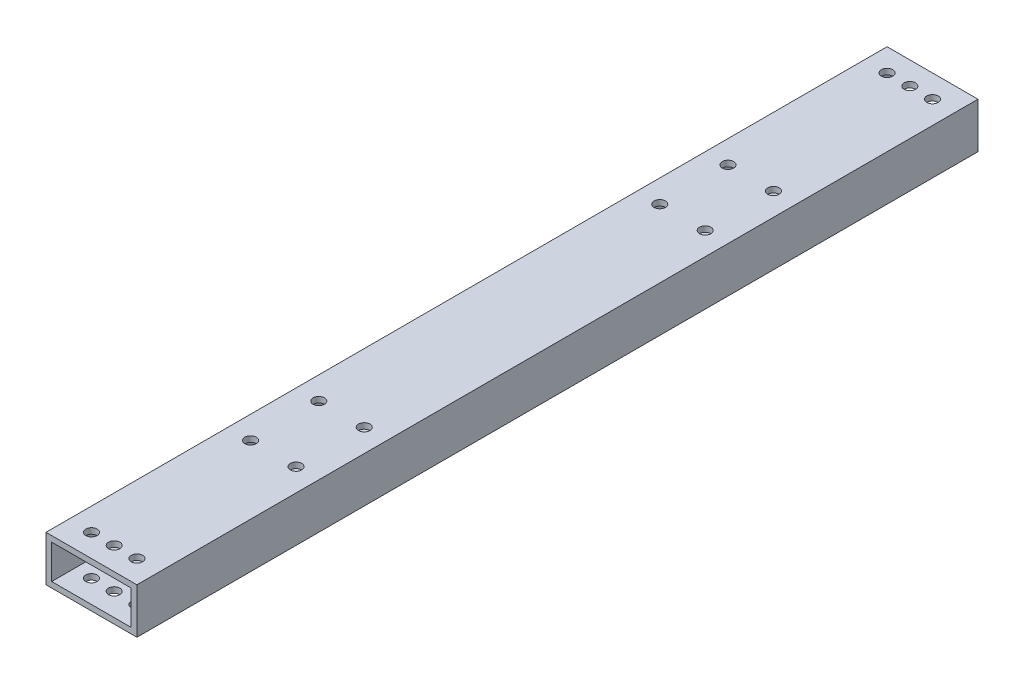
ISO-10303-21;
HEADER;
FILE_DESCRIPTION(('STEP AP214'),'2;1');
FILE_NAME('part.step','',(''),(''),'','','');
FILE_SCHEMA(('AUTOMOTIVE_DESIGN { 1 0 10303 214 1 1 1 1 }'));
ENDSEC;
DATA;
#1=APPLICATION_CONTEXT('core data for automotive mechanical design processes');
#2=APPLICATION_PROTOCOL_DEFINITION('international standard','automotive_design',2000,#1);
#3=PRODUCT_CONTEXT('',#1,'mechanical');
#4=PRODUCT('Part','Part','',(#3));
#5=PRODUCT_RELATED_PRODUCT_CATEGORY('part','',(#4));
#6=PRODUCT_DEFINITION_FORMATION('','',#4);
#7=PRODUCT_DEFINITION_CONTEXT('part definition',#1,'design');
#8=PRODUCT_DEFINITION('design','',#6,#7);
#9=PRODUCT_DEFINITION_SHAPE('','',#8);
#10=(LENGTH_UNIT() NAMED_UNIT(*) SI_UNIT(.MILLI.,.METRE.));
#11=(NAMED_UNIT(*) PLANE_ANGLE_UNIT() SI_UNIT($,.RADIAN.));
#12=(NAMED_UNIT(*) SI_UNIT($,.STERADIAN.) SOLID_ANGLE_UNIT());
#13=UNCERTAINTY_MEASURE_WITH_UNIT(LENGTH_MEASURE(1.E-05),#10,'distance_accuracy_value','');
#14=(GEOMETRIC_REPRESENTATION_CONTEXT(3) GLOBAL_UNCERTAINTY_ASSIGNED_CONTEXT((#13)) GLOBAL_UNIT_ASSIGNED_CONTEXT((#10,
#11,#12)) REPRESENTATION_CONTEXT('',''));
#15=CARTESIAN_POINT('',(0.,0.,0.));
#16=DIRECTION('',(0.,0.,1.));
#17=DIRECTION('',(1.,0.,0.));
#18=AXIS2_PLACEMENT_3D('',#15,#16,#17);
#19=CARTESIAN_POINT('',(0.,0.,469.9));
#20=DIRECTION('',(0.,0.,-1.));
#21=DIRECTION('',(-1.,0.,0.));
#22=AXIS2_PLACEMENT_3D('',#19,#20,#21);
#23=PLANE('',#22);
#24=DIRECTION('',(0.,-1.,0.));
#25=VECTOR('',#24,1.);
#26=CARTESIAN_POINT('',(0.,0.,469.9));
#27=LINE('',#26,#25);
#28=CARTESIAN_POINT('',(0.,25.4,469.9));
#29=VERTEX_POINT('',#28);
#30=CARTESIAN_POINT('',(0.,0.,469.9));
#31=VERTEX_POINT('',#30);
#32=EDGE_CURVE('E163',#29,#31,#27,.T.);
#33=ORIENTED_EDGE('',*,*,#32,.T.);
#34=DIRECTION('',(1.,0.,0.));
#35=VECTOR('',#34,1.);
#36=CARTESIAN_POINT('',(0.,0.,469.9));
#37=LINE('',#36,#35);
#38=CARTESIAN_POINT('',(50.8,0.,469.9));
#39=VERTEX_POINT('',#38);
#40=EDGE_CURVE('E167',#31,#39,#37,.T.);
#41=ORIENTED_EDGE('',*,*,#40,.T.);
#42=DIRECTION('',(0.,1.,0.));
#43=VECTOR('',#42,1.);
#44=CARTESIAN_POINT('',(50.8,0.,469.9));
#45=LINE('',#44,#43);
#46=CARTESIAN_POINT('',(50.8,25.4,469.9));
#47=VERTEX_POINT('',#46);
#48=EDGE_CURVE('E171',#39,#47,#45,.T.);
#49=ORIENTED_EDGE('',*,*,#48,.T.);
#50=DIRECTION('',(-1.,0.,0.));
#51=VECTOR('',#50,1.);
#52=CARTESIAN_POINT('',(0.,25.4,469.9));
#53=LINE('',#52,#51);
#54=EDGE_CURVE('E174',#47,#29,#53,.T.);
#55=ORIENTED_EDGE('',*,*,#54,.T.);
#56=EDGE_LOOP('',(#33,#41,#49,#55));
#57=FACE_BOUND('',#56,.T.);
#58=DIRECTION('',(0.,-1.,0.));
#59=VECTOR('',#58,1.);
#60=CARTESIAN_POINT('',(3.175,3.175,469.9));
#61=LINE('',#60,#59);
#62=CARTESIAN_POINT('',(3.175,22.225,469.9));
#63=VERTEX_POINT('',#62);
#64=CARTESIAN_POINT('',(3.175,3.175,469.9));
#65=VERTEX_POINT('',#64);
#66=EDGE_CURVE('E113',#63,#65,#61,.T.);
#67=ORIENTED_EDGE('',*,*,#66,.F.);
#68=DIRECTION('',(-1.,0.,0.));
#69=VECTOR('',#68,1.);
#70=CARTESIAN_POINT('',(3.175,22.225,469.9));
#71=LINE('',#70,#69);
#72=CARTESIAN_POINT('',(47.625,22.225,469.9));
#73=VERTEX_POINT('',#72);
#74=EDGE_CURVE('E139',#73,#63,#71,.T.);
#75=ORIENTED_EDGE('',*,*,#74,.F.);
#76=DIRECTION('',(0.,1.,0.));
#77=VECTOR('',#76,1.);
#78=CARTESIAN_POINT('',(47.625,3.175,469.9));
#79=LINE('',#78,#77);
#80=CARTESIAN_POINT('',(47.625,3.175,469.9));
#81=VERTEX_POINT('',#80);
#82=EDGE_CURVE('E135',#81,#73,#79,.T.);
#83=ORIENTED_EDGE('',*,*,#82,.F.);
#84=DIRECTION('',(1.,0.,0.));
#85=VECTOR('',#84,1.);
#86=CARTESIAN_POINT('',(3.175,3.175,469.9));
#87=LINE('',#86,#85);
#88=EDGE_CURVE('E122',#65,#81,#87,.T.);
#89=ORIENTED_EDGE('',*,*,#88,.F.);
#90=EDGE_LOOP('',(#67,#75,#83,#89));
#91=FACE_BOUND('',#90,.T.);
#92=ADVANCED_FACE('F45',(#57,#91),#23,.F.);
#93=CARTESIAN_POINT('',(0.,0.,0.));
#94=DIRECTION('',(0.,0.,-1.));
#95=DIRECTION('',(-1.,0.,0.));
#96=AXIS2_PLACEMENT_3D('',#93,#94,#95);
#97=PLANE('',#96);
#98=DIRECTION('',(0.,-1.,0.));
#99=VECTOR('',#98,1.);
#100=CARTESIAN_POINT('',(0.,0.,0.));
#101=LINE('',#100,#99);
#102=CARTESIAN_POINT('',(0.,25.4,0.));
#103=VERTEX_POINT('',#102);
#104=CARTESIAN_POINT('',(0.,0.,0.));
#105=VERTEX_POINT('',#104);
#106=EDGE_CURVE('E131',#103,#105,#101,.T.);
#107=ORIENTED_EDGE('',*,*,#106,.F.);
#108=DIRECTION('',(-1.,0.,0.));
#109=VECTOR('',#108,1.);
#110=CARTESIAN_POINT('',(0.,25.4,0.));
#111=LINE('',#110,#109);
#112=CARTESIAN_POINT('',(50.8,25.4,0.));
#113=VERTEX_POINT('',#112);
#114=EDGE_CURVE('E168',#113,#103,#111,.T.);
#115=ORIENTED_EDGE('',*,*,#114,.F.);
#116=DIRECTION('',(0.,1.,0.));
#117=VECTOR('',#116,1.);
#118=CARTESIAN_POINT('',(50.8,0.,0.));
#119=LINE('',#118,#117);
#120=CARTESIAN_POINT('',(50.8,0.,0.));
#121=VERTEX_POINT('',#120);
#122=EDGE_CURVE('E184',#121,#113,#119,.T.);
#123=ORIENTED_EDGE('',*,*,#122,.F.);
#124=DIRECTION('',(1.,0.,0.));
#125=VECTOR('',#124,1.);
#126=CARTESIAN_POINT('',(0.,0.,0.));
#127=LINE('',#126,#125);
#128=EDGE_CURVE('E181',#105,#121,#127,.T.);
#129=ORIENTED_EDGE('',*,*,#128,.F.);
#130=EDGE_LOOP('',(#107,#115,#123,#129));
#131=FACE_BOUND('',#130,.T.);
#132=DIRECTION('',(-1.,0.,0.));
#133=VECTOR('',#132,1.);
#134=CARTESIAN_POINT('',(3.175,22.225,0.));
#135=LINE('',#134,#133);
#136=CARTESIAN_POINT('',(47.625,22.225,0.));
#137=VERTEX_POINT('',#136);
#138=CARTESIAN_POINT('',(3.175,22.225,0.));
#139=VERTEX_POINT('',#138);
#140=EDGE_CURVE('E123',#137,#139,#135,.T.);
#141=ORIENTED_EDGE('',*,*,#140,.T.);
#142=DIRECTION('',(0.,-1.,0.));
#143=VECTOR('',#142,1.);
#144=CARTESIAN_POINT('',(3.175,3.175,0.));
#145=LINE('',#144,#143);
#146=CARTESIAN_POINT('',(3.175,3.175,0.));
#147=VERTEX_POINT('',#146);
#148=EDGE_CURVE('E71',#139,#147,#145,.T.);
#149=ORIENTED_EDGE('',*,*,#148,.T.);
#150=DIRECTION('',(1.,0.,0.));
#151=VECTOR('',#150,1.);
#152=CARTESIAN_POINT('',(3.175,3.175,0.));
#153=LINE('',#152,#151);
#154=CARTESIAN_POINT('',(47.625,3.175,0.));
#155=VERTEX_POINT('',#154);
#156=EDGE_CURVE('E129',#147,#155,#153,.T.);
#157=ORIENTED_EDGE('',*,*,#156,.T.);
#158=DIRECTION('',(0.,1.,0.));
#159=VECTOR('',#158,1.);
#160=CARTESIAN_POINT('',(47.625,3.175,0.));
#161=LINE('',#160,#159);
#162=EDGE_CURVE('E150',#155,#137,#161,.T.);
#163=ORIENTED_EDGE('',*,*,#162,.T.);
#164=EDGE_LOOP('',(#141,#149,#157,#163));
#165=FACE_BOUND('',#164,.T.);
#166=ADVANCED_FACE('F402',(#131,#165),#97,.T.);
#167=CARTESIAN_POINT('',(0.,0.,469.9));
#168=DIRECTION('',(1.,0.,0.));
#169=DIRECTION('',(0.,0.,-1.));
#170=AXIS2_PLACEMENT_3D('',#167,#168,#169);
#171=PLANE('',#170);
#172=ORIENTED_EDGE('',*,*,#106,.T.);
#173=DIRECTION('',(0.,0.,-1.));
#174=VECTOR('',#173,1.);
#175=CARTESIAN_POINT('',(0.,0.,469.9));
#176=LINE('',#175,#174);
#177=EDGE_CURVE('E11',#31,#105,#176,.T.);
#178=ORIENTED_EDGE('',*,*,#177,.F.);
#179=ORIENTED_EDGE('',*,*,#32,.F.);
#180=DIRECTION('',(0.,0.,-1.));
#181=VECTOR('',#180,1.);
#182=CARTESIAN_POINT('',(0.,25.4,469.9));
#183=LINE('',#182,#181);
#184=EDGE_CURVE('E177',#29,#103,#183,.T.);
#185=ORIENTED_EDGE('',*,*,#184,.T.);
#186=EDGE_LOOP('',(#172,#178,#179,#185));
#187=FACE_BOUND('',#186,.T.);
#188=ADVANCED_FACE('F47',(#187),#171,.F.);
#189=CARTESIAN_POINT('',(0.,0.,469.9));
#190=DIRECTION('',(0.,1.,0.));
#191=DIRECTION('',(0.,0.,1.));
#192=AXIS2_PLACEMENT_3D('',#189,#190,#191);
#193=PLANE('',#192);
#194=CARTESIAN_POINT('',(38.1,0.,101.6));
#195=DIRECTION('',(0.,1.,0.));
#196=DIRECTION('',(0.,0.,-1.));
#197=AXIS2_PLACEMENT_3D('',#194,#195,#196);
#198=CIRCLE('',#197,3.175);
#199=CARTESIAN_POINT('',(38.1,0.,98.425));
#200=VERTEX_POINT('',#199);
#201=EDGE_CURVE('E750',#200,#200,#198,.T.);
#202=ORIENTED_EDGE('',*,*,#201,.T.);
#203=EDGE_LOOP('',(#202));
#204=FACE_BOUND('',#203,.T.);
#205=CARTESIAN_POINT('',(12.7,0.,368.3));
#206=DIRECTION('',(0.,1.,0.));
#207=DIRECTION('',(0.,0.,1.));
#208=AXIS2_PLACEMENT_3D('',#205,#206,#207);
#209=CIRCLE('',#208,3.175);
#210=CARTESIAN_POINT('',(12.7,0.,371.475));
#211=VERTEX_POINT('',#210);
#212=EDGE_CURVE('E752',#211,#211,#209,.T.);
#213=ORIENTED_EDGE('',*,*,#212,.T.);
#214=EDGE_LOOP('',(#213));
#215=FACE_BOUND('',#214,.T.);
#216=CARTESIAN_POINT('',(12.7,0.,330.2));
#217=DIRECTION('',(0.,1.,0.));
#218=DIRECTION('',(0.,0.,1.));
#219=AXIS2_PLACEMENT_3D('',#216,#217,#218);
#220=CIRCLE('',#219,3.175);
#221=CARTESIAN_POINT('',(12.7,0.,333.375));
#222=VERTEX_POINT('',#221);
#223=EDGE_CURVE('E758',#222,#222,#220,.T.);
#224=ORIENTED_EDGE('',*,*,#223,.T.);
#225=EDGE_LOOP('',(#224));
#226=FACE_BOUND('',#225,.T.);
#227=CARTESIAN_POINT('',(12.7,0.,139.7));
#228=DIRECTION('',(0.,1.,0.));
#229=DIRECTION('',(0.,0.,1.));
#230=AXIS2_PLACEMENT_3D('',#227,#228,#229);
#231=CIRCLE('',#230,3.175);
#232=CARTESIAN_POINT('',(12.7,0.,142.875));
#233=VERTEX_POINT('',#232);
#234=EDGE_CURVE('E765',#233,#233,#231,.T.);
#235=ORIENTED_EDGE('',*,*,#234,.T.);
#236=EDGE_LOOP('',(#235));
#237=FACE_BOUND('',#236,.T.);
#238=CARTESIAN_POINT('',(38.1,0.,139.7));
#239=DIRECTION('',(0.,1.,0.));
#240=DIRECTION('',(0.,0.,-1.));
#241=AXIS2_PLACEMENT_3D('',#238,#239,#240);
#242=CIRCLE('',#241,3.175);
#243=CARTESIAN_POINT('',(38.1,0.,136.525));
#244=VERTEX_POINT('',#243);
#245=EDGE_CURVE('E753',#244,#244,#242,.T.);
#246=ORIENTED_EDGE('',*,*,#245,.T.);
#247=EDGE_LOOP('',(#246));
#248=FACE_BOUND('',#247,.T.);
#249=CARTESIAN_POINT('',(38.1000000000001,0.,330.2));
#250=DIRECTION('',(0.,1.,0.));
#251=DIRECTION('',(0.,0.,-1.));
#252=AXIS2_PLACEMENT_3D('',#249,#250,#251);
#253=CIRCLE('',#252,3.175);
#254=CARTESIAN_POINT('',(38.1000000000001,0.,327.025));
#255=VERTEX_POINT('',#254);
#256=EDGE_CURVE('E761',#255,#255,#253,.T.);
#257=ORIENTED_EDGE('',*,*,#256,.T.);
#258=EDGE_LOOP('',(#257));
#259=FACE_BOUND('',#258,.T.);
#260=CARTESIAN_POINT('',(38.1000000000001,0.,368.3));
#261=DIRECTION('',(0.,1.,0.));
#262=DIRECTION('',(0.,0.,-1.));
#263=AXIS2_PLACEMENT_3D('',#260,#261,#262);
#264=CIRCLE('',#263,3.175);
#265=CARTESIAN_POINT('',(38.1000000000001,0.,365.125));
#266=VERTEX_POINT('',#265);
#267=EDGE_CURVE('E867',#266,#266,#264,.T.);
#268=ORIENTED_EDGE('',*,*,#267,.T.);
#269=EDGE_LOOP('',(#268));
#270=FACE_BOUND('',#269,.T.);
#271=CARTESIAN_POINT('',(12.7,0.,101.6));
#272=DIRECTION('',(0.,1.,0.));
#273=DIRECTION('',(0.,0.,1.));
#274=AXIS2_PLACEMENT_3D('',#271,#272,#273);
#275=CIRCLE('',#274,3.175);
#276=CARTESIAN_POINT('',(12.7,0.,104.775));
#277=VERTEX_POINT('',#276);
#278=EDGE_CURVE('E234',#277,#277,#275,.T.);
#279=ORIENTED_EDGE('',*,*,#278,.T.);
#280=EDGE_LOOP('',(#279));
#281=FACE_BOUND('',#280,.T.);
#282=CARTESIAN_POINT('',(38.0999999999999,0.,12.6999999999999));
#283=DIRECTION('',(0.,1.,0.));
#284=DIRECTION('',(0.,0.,1.));
#285=AXIS2_PLACEMENT_3D('',#282,#283,#284);
#286=CIRCLE('',#285,3.175);
#287=CARTESIAN_POINT('',(38.0999999999999,0.,15.8749999999999));
#288=VERTEX_POINT('',#287);
#289=EDGE_CURVE('E301',#288,#288,#286,.T.);
#290=ORIENTED_EDGE('',*,*,#289,.T.);
#291=EDGE_LOOP('',(#290));
#292=FACE_BOUND('',#291,.T.);
#293=CARTESIAN_POINT('',(25.4,0.,457.2));
#294=DIRECTION('',(0.,1.,0.));
#295=DIRECTION('',(0.,0.,1.));
#296=AXIS2_PLACEMENT_3D('',#293,#294,#295);
#297=CIRCLE('',#296,3.175);
#298=CARTESIAN_POINT('',(25.4,0.,460.375));
#299=VERTEX_POINT('',#298);
#300=EDGE_CURVE('E310',#299,#299,#297,.T.);
#301=ORIENTED_EDGE('',*,*,#300,.T.);
#302=EDGE_LOOP('',(#301));
#303=FACE_BOUND('',#302,.T.);
#304=CARTESIAN_POINT('',(25.3999999999999,0.,12.6999999999999));
#305=DIRECTION('',(0.,1.,0.));
#306=DIRECTION('',(0.,0.,1.));
#307=AXIS2_PLACEMENT_3D('',#304,#305,#306);
#308=CIRCLE('',#307,3.175);
#309=CARTESIAN_POINT('',(25.3999999999999,0.,15.8749999999999));
#310=VERTEX_POINT('',#309);
#311=EDGE_CURVE('E309',#310,#310,#308,.T.);
#312=ORIENTED_EDGE('',*,*,#311,.T.);
#313=EDGE_LOOP('',(#312));
#314=FACE_BOUND('',#313,.T.);
#315=CARTESIAN_POINT('',(12.7,0.,457.2));
#316=DIRECTION('',(0.,1.,0.));
#317=DIRECTION('',(0.,0.,1.));
#318=AXIS2_PLACEMENT_3D('',#315,#316,#317);
#319=CIRCLE('',#318,3.175);
#320=CARTESIAN_POINT('',(12.7,0.,460.375));
#321=VERTEX_POINT('',#320);
#322=EDGE_CURVE('E326',#321,#321,#319,.T.);
#323=ORIENTED_EDGE('',*,*,#322,.T.);
#324=EDGE_LOOP('',(#323));
#325=FACE_BOUND('',#324,.T.);
#326=CARTESIAN_POINT('',(38.1,0.,457.2));
#327=DIRECTION('',(0.,1.,0.));
#328=DIRECTION('',(0.,0.,1.));
#329=AXIS2_PLACEMENT_3D('',#326,#327,#328);
#330=CIRCLE('',#329,3.175);
#331=CARTESIAN_POINT('',(38.1,0.,460.375));
#332=VERTEX_POINT('',#331);
#333=EDGE_CURVE('E296',#332,#332,#330,.T.);
#334=ORIENTED_EDGE('',*,*,#333,.T.);
#335=EDGE_LOOP('',(#334));
#336=FACE_BOUND('',#335,.T.);
#337=CARTESIAN_POINT('',(12.6999999999999,0.,12.6999999999999));
#338=DIRECTION('',(0.,1.,0.));
#339=DIRECTION('',(0.,0.,1.));
#340=AXIS2_PLACEMENT_3D('',#337,#338,#339);
#341=CIRCLE('',#340,3.175);
#342=CARTESIAN_POINT('',(12.6999999999999,0.,15.8749999999999));
#343=VERTEX_POINT('',#342);
#344=EDGE_CURVE('E204',#343,#343,#341,.T.);
#345=ORIENTED_EDGE('',*,*,#344,.T.);
#346=EDGE_LOOP('',(#345));
#347=FACE_BOUND('',#346,.T.);
#348=ORIENTED_EDGE('',*,*,#128,.T.);
#349=DIRECTION('',(0.,0.,-1.));
#350=VECTOR('',#349,1.);
#351=CARTESIAN_POINT('',(50.8,0.,469.9));
#352=LINE('',#351,#350);
#353=EDGE_CURVE('E55',#39,#121,#352,.T.);
#354=ORIENTED_EDGE('',*,*,#353,.F.);
#355=ORIENTED_EDGE('',*,*,#40,.F.);
#356=ORIENTED_EDGE('',*,*,#177,.T.);
#357=EDGE_LOOP('',(#348,#354,#355,#356));
#358=FACE_BOUND('',#357,.T.);
#359=ADVANCED_FACE('F388',(#204,#215,#226,#237,#248,#259,#270,#281,#292,#303,#314,#325,#336,
#347,#358),#193,.F.);
#360=CARTESIAN_POINT('',(50.8,0.,469.9));
#361=DIRECTION('',(-1.,0.,0.));
#362=DIRECTION('',(0.,0.,1.));
#363=AXIS2_PLACEMENT_3D('',#360,#361,#362);
#364=PLANE('',#363);
#365=ORIENTED_EDGE('',*,*,#122,.T.);
#366=DIRECTION('',(0.,0.,-1.));
#367=VECTOR('',#366,1.);
#368=CARTESIAN_POINT('',(50.8,25.4,469.9));
#369=LINE('',#368,#367);
#370=EDGE_CURVE('E192',#47,#113,#369,.T.);
#371=ORIENTED_EDGE('',*,*,#370,.F.);
#372=ORIENTED_EDGE('',*,*,#48,.F.);
#373=ORIENTED_EDGE('',*,*,#353,.T.);
#374=EDGE_LOOP('',(#365,#371,#372,#373));
#375=FACE_BOUND('',#374,.T.);
#376=ADVANCED_FACE('F391',(#375),#364,.F.);
#377=CARTESIAN_POINT('',(0.,25.4,469.9));
#378=DIRECTION('',(0.,-1.,0.));
#379=DIRECTION('',(0.,0.,-1.));
#380=AXIS2_PLACEMENT_3D('',#377,#378,#379);
#381=PLANE('',#380);
#382=CARTESIAN_POINT('',(38.1,25.4,101.6));
#383=DIRECTION('',(0.,-1.,0.));
#384=DIRECTION('',(0.,0.,-1.));
#385=AXIS2_PLACEMENT_3D('',#382,#383,#384);
#386=CIRCLE('',#385,3.175);
#387=CARTESIAN_POINT('',(38.1,25.4,98.425));
#388=VERTEX_POINT('',#387);
#389=EDGE_CURVE('E292',#388,#388,#386,.T.);
#390=ORIENTED_EDGE('',*,*,#389,.T.);
#391=EDGE_LOOP('',(#390));
#392=FACE_BOUND('',#391,.T.);
#393=CARTESIAN_POINT('',(12.7,25.4,368.3));
#394=DIRECTION('',(0.,-1.,0.));
#395=DIRECTION('',(0.,0.,-1.));
#396=AXIS2_PLACEMENT_3D('',#393,#394,#395);
#397=CIRCLE('',#396,3.175);
#398=CARTESIAN_POINT('',(12.7,25.4,365.125));
#399=VERTEX_POINT('',#398);
#400=EDGE_CURVE('E274',#399,#399,#397,.T.);
#401=ORIENTED_EDGE('',*,*,#400,.T.);
#402=EDGE_LOOP('',(#401));
#403=FACE_BOUND('',#402,.T.);
#404=CARTESIAN_POINT('',(12.7,25.4,330.2));
#405=DIRECTION('',(0.,-1.,0.));
#406=DIRECTION('',(0.,0.,-1.));
#407=AXIS2_PLACEMENT_3D('',#404,#405,#406);
#408=CIRCLE('',#407,3.175);
#409=CARTESIAN_POINT('',(12.7,25.4,327.025));
#410=VERTEX_POINT('',#409);
#411=EDGE_CURVE('E268',#410,#410,#408,.T.);
#412=ORIENTED_EDGE('',*,*,#411,.T.);
#413=EDGE_LOOP('',(#412));
#414=FACE_BOUND('',#413,.T.);
#415=CARTESIAN_POINT('',(12.7,25.4,139.7));
#416=DIRECTION('',(0.,-1.,0.));
#417=DIRECTION('',(0.,0.,-1.));
#418=AXIS2_PLACEMENT_3D('',#415,#416,#417);
#419=CIRCLE('',#418,3.175);
#420=CARTESIAN_POINT('',(12.7,25.4,136.525));
#421=VERTEX_POINT('',#420);
#422=EDGE_CURVE('E263',#421,#421,#419,.T.);
#423=ORIENTED_EDGE('',*,*,#422,.T.);
#424=EDGE_LOOP('',(#423));
#425=FACE_BOUND('',#424,.T.);
#426=CARTESIAN_POINT('',(38.1,25.4,139.7));
#427=DIRECTION('',(0.,-1.,0.));
#428=DIRECTION('',(0.,0.,-1.));
#429=AXIS2_PLACEMENT_3D('',#426,#427,#428);
#430=CIRCLE('',#429,3.175);
#431=CARTESIAN_POINT('',(38.1,25.4,136.525));
#432=VERTEX_POINT('',#431);
#433=EDGE_CURVE('E258',#432,#432,#430,.T.);
#434=ORIENTED_EDGE('',*,*,#433,.T.);
#435=EDGE_LOOP('',(#434));
#436=FACE_BOUND('',#435,.T.);
#437=CARTESIAN_POINT('',(38.1000000000001,25.4,330.2));
#438=DIRECTION('',(0.,-1.,0.));
#439=DIRECTION('',(0.,0.,-1.));
#440=AXIS2_PLACEMENT_3D('',#437,#438,#439);
#441=CIRCLE('',#440,3.175);
#442=CARTESIAN_POINT('',(38.1000000000001,25.4,327.025));
#443=VERTEX_POINT('',#442);
#444=EDGE_CURVE('E252',#443,#443,#441,.T.);
#445=ORIENTED_EDGE('',*,*,#444,.T.);
#446=EDGE_LOOP('',(#445));
#447=FACE_BOUND('',#446,.T.);
#448=CARTESIAN_POINT('',(38.1000000000001,25.4,368.3));
#449=DIRECTION('',(0.,-1.,0.));
#450=DIRECTION('',(0.,0.,-1.));
#451=AXIS2_PLACEMENT_3D('',#448,#449,#450);
#452=CIRCLE('',#451,3.175);
#453=CARTESIAN_POINT('',(38.1000000000001,25.4,365.125));
#454=VERTEX_POINT('',#453);
#455=EDGE_CURVE('E246',#454,#454,#452,.T.);
#456=ORIENTED_EDGE('',*,*,#455,.T.);
#457=EDGE_LOOP('',(#456));
#458=FACE_BOUND('',#457,.T.);
#459=CARTESIAN_POINT('',(12.7,25.4,101.6));
#460=DIRECTION('',(0.,-1.,0.));
#461=DIRECTION('',(0.,0.,-1.));
#462=AXIS2_PLACEMENT_3D('',#459,#460,#461);
#463=CIRCLE('',#462,3.175);
#464=CARTESIAN_POINT('',(12.7,25.4,98.425));
#465=VERTEX_POINT('',#464);
#466=EDGE_CURVE('E240',#465,#465,#463,.T.);
#467=ORIENTED_EDGE('',*,*,#466,.T.);
#468=EDGE_LOOP('',(#467));
#469=FACE_BOUND('',#468,.T.);
#470=CARTESIAN_POINT('',(38.0999999999999,25.4,12.6999999999999));
#471=DIRECTION('',(0.,1.,0.));
#472=DIRECTION('',(0.,0.,1.));
#473=AXIS2_PLACEMENT_3D('',#470,#471,#472);
#474=CIRCLE('',#473,3.175);
#475=CARTESIAN_POINT('',(38.0999999999999,25.4,15.8749999999999));
#476=VERTEX_POINT('',#475);
#477=EDGE_CURVE('E314',#476,#476,#474,.T.);
#478=ORIENTED_EDGE('',*,*,#477,.F.);
#479=EDGE_LOOP('',(#478));
#480=FACE_BOUND('',#479,.T.);
#481=CARTESIAN_POINT('',(25.4,25.4,457.2));
#482=DIRECTION('',(0.,1.,0.));
#483=DIRECTION('',(0.,0.,1.));
#484=AXIS2_PLACEMENT_3D('',#481,#482,#483);
#485=CIRCLE('',#484,3.175);
#486=CARTESIAN_POINT('',(25.4,25.4,460.375));
#487=VERTEX_POINT('',#486);
#488=EDGE_CURVE('E305',#487,#487,#485,.T.);
#489=ORIENTED_EDGE('',*,*,#488,.F.);
#490=EDGE_LOOP('',(#489));
#491=FACE_BOUND('',#490,.T.);
#492=CARTESIAN_POINT('',(25.3999999999999,25.4,12.6999999999999));
#493=DIRECTION('',(0.,1.,0.));
#494=DIRECTION('',(0.,0.,1.));
#495=AXIS2_PLACEMENT_3D('',#492,#493,#494);
#496=CIRCLE('',#495,3.175);
#497=CARTESIAN_POINT('',(25.3999999999999,25.4,15.8749999999999));
#498=VERTEX_POINT('',#497);
#499=EDGE_CURVE('E330',#498,#498,#496,.T.);
#500=ORIENTED_EDGE('',*,*,#499,.F.);
#501=EDGE_LOOP('',(#500));
#502=FACE_BOUND('',#501,.T.);
#503=CARTESIAN_POINT('',(12.7,25.4,457.2));
#504=DIRECTION('',(0.,1.,0.));
#505=DIRECTION('',(0.,0.,1.));
#506=AXIS2_PLACEMENT_3D('',#503,#504,#505);
#507=CIRCLE('',#506,3.175);
#508=CARTESIAN_POINT('',(12.7,25.4,460.375));
#509=VERTEX_POINT('',#508);
#510=EDGE_CURVE('E321',#509,#509,#507,.T.);
#511=ORIENTED_EDGE('',*,*,#510,.F.);
#512=EDGE_LOOP('',(#511));
#513=FACE_BOUND('',#512,.T.);
#514=CARTESIAN_POINT('',(38.1,25.4,457.2));
#515=DIRECTION('',(0.,1.,0.));
#516=DIRECTION('',(0.,0.,1.));
#517=AXIS2_PLACEMENT_3D('',#514,#515,#516);
#518=CIRCLE('',#517,3.175);
#519=CARTESIAN_POINT('',(38.1,25.4,460.375));
#520=VERTEX_POINT('',#519);
#521=EDGE_CURVE('E297',#520,#520,#518,.T.);
#522=ORIENTED_EDGE('',*,*,#521,.F.);
#523=EDGE_LOOP('',(#522));
#524=FACE_BOUND('',#523,.T.);
#525=CARTESIAN_POINT('',(12.6999999999999,25.4,12.6999999999999));
#526=DIRECTION('',(0.,1.,0.));
#527=DIRECTION('',(0.,0.,1.));
#528=AXIS2_PLACEMENT_3D('',#525,#526,#527);
#529=CIRCLE('',#528,3.175);
#530=CARTESIAN_POINT('',(12.6999999999999,25.4,15.8749999999999));
#531=VERTEX_POINT('',#530);
#532=EDGE_CURVE('E325',#531,#531,#529,.T.);
#533=ORIENTED_EDGE('',*,*,#532,.F.);
#534=EDGE_LOOP('',(#533));
#535=FACE_BOUND('',#534,.T.);
#536=ORIENTED_EDGE('',*,*,#114,.T.);
#537=ORIENTED_EDGE('',*,*,#184,.F.);
#538=ORIENTED_EDGE('',*,*,#54,.F.);
#539=ORIENTED_EDGE('',*,*,#370,.T.);
#540=EDGE_LOOP('',(#536,#537,#538,#539));
#541=FACE_BOUND('',#540,.T.);
#542=ADVANCED_FACE('F406',(#392,#403,#414,#425,#436,#447,#458,#469,#480,#491,#502,#513,#524,
#535,#541),#381,.F.);
#543=CARTESIAN_POINT('',(3.175,3.175,469.9));
#544=DIRECTION('',(1.,0.,0.));
#545=DIRECTION('',(0.,0.,-1.));
#546=AXIS2_PLACEMENT_3D('',#543,#544,#545);
#547=PLANE('',#546);
#548=ORIENTED_EDGE('',*,*,#148,.F.);
#549=DIRECTION('',(0.,0.,-1.));
#550=VECTOR('',#549,1.);
#551=CARTESIAN_POINT('',(3.175,22.225,469.9));
#552=LINE('',#551,#550);
#553=EDGE_CURVE('E117',#63,#139,#552,.T.);
#554=ORIENTED_EDGE('',*,*,#553,.F.);
#555=ORIENTED_EDGE('',*,*,#66,.T.);
#556=DIRECTION('',(0.,0.,-1.));
#557=VECTOR('',#556,1.);
#558=CARTESIAN_POINT('',(3.175,3.175,469.9));
#559=LINE('',#558,#557);
#560=EDGE_CURVE('E116',#65,#147,#559,.T.);
#561=ORIENTED_EDGE('',*,*,#560,.T.);
#562=EDGE_LOOP('',(#548,#554,#555,#561));
#563=FACE_BOUND('',#562,.T.);
#564=ADVANCED_FACE('F115',(#563),#547,.T.);
#565=CARTESIAN_POINT('',(3.175,3.175,469.9));
#566=DIRECTION('',(0.,1.,0.));
#567=DIRECTION('',(0.,0.,1.));
#568=AXIS2_PLACEMENT_3D('',#565,#566,#567);
#569=PLANE('',#568);
#570=CARTESIAN_POINT('',(38.1,3.175,101.6));
#571=DIRECTION('',(0.,1.,0.));
#572=DIRECTION('',(0.,0.,1.));
#573=AXIS2_PLACEMENT_3D('',#570,#571,#572);
#574=CIRCLE('',#573,3.175);
#575=CARTESIAN_POINT('',(38.1,3.175,104.775));
#576=VERTEX_POINT('',#575);
#577=EDGE_CURVE('E288',#576,#576,#574,.T.);
#578=ORIENTED_EDGE('',*,*,#577,.F.);
#579=EDGE_LOOP('',(#578));
#580=FACE_BOUND('',#579,.T.);
#581=CARTESIAN_POINT('',(12.7,3.175,368.3));
#582=DIRECTION('',(0.,1.,0.));
#583=DIRECTION('',(0.,0.,1.));
#584=AXIS2_PLACEMENT_3D('',#581,#582,#583);
#585=CIRCLE('',#584,3.175);
#586=CARTESIAN_POINT('',(12.7,3.175,371.475));
#587=VERTEX_POINT('',#586);
#588=EDGE_CURVE('E267',#587,#587,#585,.T.);
#589=ORIENTED_EDGE('',*,*,#588,.F.);
#590=EDGE_LOOP('',(#589));
#591=FACE_BOUND('',#590,.T.);
#592=CARTESIAN_POINT('',(12.7,3.175,330.2));
#593=DIRECTION('',(0.,1.,0.));
#594=DIRECTION('',(0.,0.,1.));
#595=AXIS2_PLACEMENT_3D('',#592,#593,#594);
#596=CIRCLE('',#595,3.175);
#597=CARTESIAN_POINT('',(12.7,3.175,333.375));
#598=VERTEX_POINT('',#597);
#599=EDGE_CURVE('E262',#598,#598,#596,.T.);
#600=ORIENTED_EDGE('',*,*,#599,.F.);
#601=EDGE_LOOP('',(#600));
#602=FACE_BOUND('',#601,.T.);
#603=CARTESIAN_POINT('',(12.7,3.175,139.7));
#604=DIRECTION('',(0.,1.,0.));
#605=DIRECTION('',(0.,0.,1.));
#606=AXIS2_PLACEMENT_3D('',#603,#604,#605);
#607=CIRCLE('',#606,3.175);
#608=CARTESIAN_POINT('',(12.7,3.175,142.875));
#609=VERTEX_POINT('',#608);
#610=EDGE_CURVE('E257',#609,#609,#607,.T.);
#611=ORIENTED_EDGE('',*,*,#610,.F.);
#612=EDGE_LOOP('',(#611));
#613=FACE_BOUND('',#612,.T.);
#614=CARTESIAN_POINT('',(38.1,3.175,139.7));
#615=DIRECTION('',(0.,1.,0.));
#616=DIRECTION('',(0.,0.,1.));
#617=AXIS2_PLACEMENT_3D('',#614,#615,#616);
#618=CIRCLE('',#617,3.175);
#619=CARTESIAN_POINT('',(38.1,3.175,142.875));
#620=VERTEX_POINT('',#619);
#621=EDGE_CURVE('E251',#620,#620,#618,.T.);
#622=ORIENTED_EDGE('',*,*,#621,.F.);
#623=EDGE_LOOP('',(#622));
#624=FACE_BOUND('',#623,.T.);
#625=CARTESIAN_POINT('',(38.1000000000001,3.175,330.2));
#626=DIRECTION('',(0.,1.,0.));
#627=DIRECTION('',(0.,0.,1.));
#628=AXIS2_PLACEMENT_3D('',#625,#626,#627);
#629=CIRCLE('',#628,3.175);
#630=CARTESIAN_POINT('',(38.1000000000001,3.175,333.375));
#631=VERTEX_POINT('',#630);
#632=EDGE_CURVE('E245',#631,#631,#629,.T.);
#633=ORIENTED_EDGE('',*,*,#632,.F.);
#634=EDGE_LOOP('',(#633));
#635=FACE_BOUND('',#634,.T.);
#636=CARTESIAN_POINT('',(38.1000000000001,3.175,368.3));
#637=DIRECTION('',(0.,1.,0.));
#638=DIRECTION('',(0.,0.,1.));
#639=AXIS2_PLACEMENT_3D('',#636,#637,#638);
#640=CIRCLE('',#639,3.175);
#641=CARTESIAN_POINT('',(38.1000000000001,3.175,371.475));
#642=VERTEX_POINT('',#641);
#643=EDGE_CURVE('E239',#642,#642,#640,.T.);
#644=ORIENTED_EDGE('',*,*,#643,.F.);
#645=EDGE_LOOP('',(#644));
#646=FACE_BOUND('',#645,.T.);
#647=CARTESIAN_POINT('',(12.7,3.175,101.6));
#648=DIRECTION('',(0.,1.,0.));
#649=DIRECTION('',(0.,0.,1.));
#650=AXIS2_PLACEMENT_3D('',#647,#648,#649);
#651=CIRCLE('',#650,3.175);
#652=CARTESIAN_POINT('',(12.7,3.175,104.775));
#653=VERTEX_POINT('',#652);
#654=EDGE_CURVE('E233',#653,#653,#651,.T.);
#655=ORIENTED_EDGE('',*,*,#654,.F.);
#656=EDGE_LOOP('',(#655));
#657=FACE_BOUND('',#656,.T.);
#658=CARTESIAN_POINT('',(38.0999999999999,3.175,12.6999999999999));
#659=DIRECTION('',(0.,1.,0.));
#660=DIRECTION('',(0.,0.,1.));
#661=AXIS2_PLACEMENT_3D('',#658,#659,#660);
#662=CIRCLE('',#661,3.175);
#663=CARTESIAN_POINT('',(38.0999999999999,3.175,15.8749999999999));
#664=VERTEX_POINT('',#663);
#665=EDGE_CURVE('E147',#664,#664,#662,.T.);
#666=ORIENTED_EDGE('',*,*,#665,.F.);
#667=EDGE_LOOP('',(#666));
#668=FACE_BOUND('',#667,.T.);
#669=CARTESIAN_POINT('',(25.4,3.175,457.2));
#670=DIRECTION('',(0.,1.,0.));
#671=DIRECTION('',(0.,0.,1.));
#672=AXIS2_PLACEMENT_3D('',#669,#670,#671);
#673=CIRCLE('',#672,3.175);
#674=CARTESIAN_POINT('',(25.4,3.175,460.375));
#675=VERTEX_POINT('',#674);
#676=EDGE_CURVE('E224',#675,#675,#673,.T.);
#677=ORIENTED_EDGE('',*,*,#676,.F.);
#678=EDGE_LOOP('',(#677));
#679=FACE_BOUND('',#678,.T.);
#680=CARTESIAN_POINT('',(25.3999999999999,3.175,12.6999999999999));
#681=DIRECTION('',(0.,1.,0.));
#682=DIRECTION('',(0.,0.,1.));
#683=AXIS2_PLACEMENT_3D('',#680,#681,#682);
#684=CIRCLE('',#683,3.175);
#685=CARTESIAN_POINT('',(25.3999999999999,3.175,15.8749999999999));
#686=VERTEX_POINT('',#685);
#687=EDGE_CURVE('E219',#686,#686,#684,.T.);
#688=ORIENTED_EDGE('',*,*,#687,.F.);
#689=EDGE_LOOP('',(#688));
#690=FACE_BOUND('',#689,.T.);
#691=CARTESIAN_POINT('',(12.7,3.175,457.2));
#692=DIRECTION('',(0.,1.,0.));
#693=DIRECTION('',(0.,0.,1.));
#694=AXIS2_PLACEMENT_3D('',#691,#692,#693);
#695=CIRCLE('',#694,3.175);
#696=CARTESIAN_POINT('',(12.7,3.175,460.375));
#697=VERTEX_POINT('',#696);
#698=EDGE_CURVE('E214',#697,#697,#695,.T.);
#699=ORIENTED_EDGE('',*,*,#698,.F.);
#700=EDGE_LOOP('',(#699));
#701=FACE_BOUND('',#700,.T.);
#702=CARTESIAN_POINT('',(38.1,3.175,457.2));
#703=DIRECTION('',(0.,1.,0.));
#704=DIRECTION('',(0.,0.,1.));
#705=AXIS2_PLACEMENT_3D('',#702,#703,#704);
#706=CIRCLE('',#705,3.175);
#707=CARTESIAN_POINT('',(38.1,3.175,460.375));
#708=VERTEX_POINT('',#707);
#709=EDGE_CURVE('E209',#708,#708,#706,.T.);
#710=ORIENTED_EDGE('',*,*,#709,.F.);
#711=EDGE_LOOP('',(#710));
#712=FACE_BOUND('',#711,.T.);
#713=CARTESIAN_POINT('',(12.6999999999999,3.175,12.6999999999999));
#714=DIRECTION('',(0.,1.,0.));
#715=DIRECTION('',(0.,0.,1.));
#716=AXIS2_PLACEMENT_3D('',#713,#714,#715);
#717=CIRCLE('',#716,3.175);
#718=CARTESIAN_POINT('',(12.6999999999999,3.175,15.8749999999999));
#719=VERTEX_POINT('',#718);
#720=EDGE_CURVE('E203',#719,#719,#717,.T.);
#721=ORIENTED_EDGE('',*,*,#720,.F.);
#722=EDGE_LOOP('',(#721));
#723=FACE_BOUND('',#722,.T.);
#724=ORIENTED_EDGE('',*,*,#156,.F.);
#725=ORIENTED_EDGE('',*,*,#560,.F.);
#726=ORIENTED_EDGE('',*,*,#88,.T.);
#727=DIRECTION('',(0.,0.,-1.));
#728=VECTOR('',#727,1.);
#729=CARTESIAN_POINT('',(47.625,3.175,469.9));
#730=LINE('',#729,#728);
#731=EDGE_CURVE('E132',#81,#155,#730,.T.);
#732=ORIENTED_EDGE('',*,*,#731,.T.);
#733=EDGE_LOOP('',(#724,#725,#726,#732));
#734=FACE_BOUND('',#733,.T.);
#735=ADVANCED_FACE('F126',(#580,#591,#602,#613,#624,#635,#646,#657,#668,#679,#690,#701,#712,
#723,#734),#569,.T.);
#736=CARTESIAN_POINT('',(47.625,3.175,469.9));
#737=DIRECTION('',(-1.,0.,0.));
#738=DIRECTION('',(0.,0.,1.));
#739=AXIS2_PLACEMENT_3D('',#736,#737,#738);
#740=PLANE('',#739);
#741=ORIENTED_EDGE('',*,*,#162,.F.);
#742=ORIENTED_EDGE('',*,*,#731,.F.);
#743=ORIENTED_EDGE('',*,*,#82,.T.);
#744=DIRECTION('',(0.,0.,-1.));
#745=VECTOR('',#744,1.);
#746=CARTESIAN_POINT('',(47.625,22.225,469.9));
#747=LINE('',#746,#745);
#748=EDGE_CURVE('E63',#73,#137,#747,.T.);
#749=ORIENTED_EDGE('',*,*,#748,.T.);
#750=EDGE_LOOP('',(#741,#742,#743,#749));
#751=FACE_BOUND('',#750,.T.);
#752=ADVANCED_FACE('F366',(#751),#740,.T.);
#753=CARTESIAN_POINT('',(3.175,22.225,469.9));
#754=DIRECTION('',(0.,-1.,0.));
#755=DIRECTION('',(0.,0.,-1.));
#756=AXIS2_PLACEMENT_3D('',#753,#754,#755);
#757=PLANE('',#756);
#758=CARTESIAN_POINT('',(38.1,22.225,101.6));
#759=DIRECTION('',(0.,-1.,0.));
#760=DIRECTION('',(0.,0.,-1.));
#761=AXIS2_PLACEMENT_3D('',#758,#759,#760);
#762=CIRCLE('',#761,3.175);
#763=CARTESIAN_POINT('',(38.1,22.225,98.425));
#764=VERTEX_POINT('',#763);
#765=EDGE_CURVE('E49',#764,#764,#762,.T.);
#766=ORIENTED_EDGE('',*,*,#765,.F.);
#767=EDGE_LOOP('',(#766));
#768=FACE_BOUND('',#767,.T.);
#769=CARTESIAN_POINT('',(12.7,22.225,368.3));
#770=DIRECTION('',(0.,-1.,0.));
#771=DIRECTION('',(0.,0.,-1.));
#772=AXIS2_PLACEMENT_3D('',#769,#770,#771);
#773=CIRCLE('',#772,3.175);
#774=CARTESIAN_POINT('',(12.7,22.225,365.125));
#775=VERTEX_POINT('',#774);
#776=EDGE_CURVE('E264',#775,#775,#773,.T.);
#777=ORIENTED_EDGE('',*,*,#776,.F.);
#778=EDGE_LOOP('',(#777));
#779=FACE_BOUND('',#778,.T.);
#780=CARTESIAN_POINT('',(12.7,22.225,330.2));
#781=DIRECTION('',(0.,-1.,0.));
#782=DIRECTION('',(0.,0.,-1.));
#783=AXIS2_PLACEMENT_3D('',#780,#781,#782);
#784=CIRCLE('',#783,3.175);
#785=CARTESIAN_POINT('',(12.7,22.225,327.025));
#786=VERTEX_POINT('',#785);
#787=EDGE_CURVE('E259',#786,#786,#784,.T.);
#788=ORIENTED_EDGE('',*,*,#787,.F.);
#789=EDGE_LOOP('',(#788));
#790=FACE_BOUND('',#789,.T.);
#791=CARTESIAN_POINT('',(12.7,22.225,139.7));
#792=DIRECTION('',(0.,-1.,0.));
#793=DIRECTION('',(0.,0.,-1.));
#794=AXIS2_PLACEMENT_3D('',#791,#792,#793);
#795=CIRCLE('',#794,3.175);
#796=CARTESIAN_POINT('',(12.7,22.225,136.525));
#797=VERTEX_POINT('',#796);
#798=EDGE_CURVE('E253',#797,#797,#795,.T.);
#799=ORIENTED_EDGE('',*,*,#798,.F.);
#800=EDGE_LOOP('',(#799));
#801=FACE_BOUND('',#800,.T.);
#802=CARTESIAN_POINT('',(38.1,22.225,139.7));
#803=DIRECTION('',(0.,-1.,0.));
#804=DIRECTION('',(0.,0.,-1.));
#805=AXIS2_PLACEMENT_3D('',#802,#803,#804);
#806=CIRCLE('',#805,3.175);
#807=CARTESIAN_POINT('',(38.1,22.225,136.525));
#808=VERTEX_POINT('',#807);
#809=EDGE_CURVE('E247',#808,#808,#806,.T.);
#810=ORIENTED_EDGE('',*,*,#809,.F.);
#811=EDGE_LOOP('',(#810));
#812=FACE_BOUND('',#811,.T.);
#813=CARTESIAN_POINT('',(38.1000000000001,22.225,330.2));
#814=DIRECTION('',(0.,-1.,0.));
#815=DIRECTION('',(0.,0.,-1.));
#816=AXIS2_PLACEMENT_3D('',#813,#814,#815);
#817=CIRCLE('',#816,3.175);
#818=CARTESIAN_POINT('',(38.1000000000001,22.225,327.025));
#819=VERTEX_POINT('',#818);
#820=EDGE_CURVE('E241',#819,#819,#817,.T.);
#821=ORIENTED_EDGE('',*,*,#820,.F.);
#822=EDGE_LOOP('',(#821));
#823=FACE_BOUND('',#822,.T.);
#824=CARTESIAN_POINT('',(38.1000000000001,22.225,368.3));
#825=DIRECTION('',(0.,-1.,0.));
#826=DIRECTION('',(0.,0.,-1.));
#827=AXIS2_PLACEMENT_3D('',#824,#825,#826);
#828=CIRCLE('',#827,3.175);
#829=CARTESIAN_POINT('',(38.1000000000001,22.225,365.125));
#830=VERTEX_POINT('',#829);
#831=EDGE_CURVE('E235',#830,#830,#828,.T.);
#832=ORIENTED_EDGE('',*,*,#831,.F.);
#833=EDGE_LOOP('',(#832));
#834=FACE_BOUND('',#833,.T.);
#835=CARTESIAN_POINT('',(12.7,22.225,101.6));
#836=DIRECTION('',(0.,-1.,0.));
#837=DIRECTION('',(0.,0.,-1.));
#838=AXIS2_PLACEMENT_3D('',#835,#836,#837);
#839=CIRCLE('',#838,3.175);
#840=CARTESIAN_POINT('',(12.7,22.225,98.425));
#841=VERTEX_POINT('',#840);
#842=EDGE_CURVE('E229',#841,#841,#839,.T.);
#843=ORIENTED_EDGE('',*,*,#842,.F.);
#844=EDGE_LOOP('',(#843));
#845=FACE_BOUND('',#844,.T.);
#846=CARTESIAN_POINT('',(38.0999999999999,22.225,12.6999999999999));
#847=DIRECTION('',(0.,-1.,0.));
#848=DIRECTION('',(0.,0.,-1.));
#849=AXIS2_PLACEMENT_3D('',#846,#847,#848);
#850=CIRCLE('',#849,3.175);
#851=CARTESIAN_POINT('',(38.0999999999999,22.225,9.52499999999992));
#852=VERTEX_POINT('',#851);
#853=EDGE_CURVE('E225',#852,#852,#850,.T.);
#854=ORIENTED_EDGE('',*,*,#853,.F.);
#855=EDGE_LOOP('',(#854));
#856=FACE_BOUND('',#855,.T.);
#857=CARTESIAN_POINT('',(25.4,22.225,457.2));
#858=DIRECTION('',(0.,-1.,0.));
#859=DIRECTION('',(0.,0.,-1.));
#860=AXIS2_PLACEMENT_3D('',#857,#858,#859);
#861=CIRCLE('',#860,3.175);
#862=CARTESIAN_POINT('',(25.4,22.225,454.025));
#863=VERTEX_POINT('',#862);
#864=EDGE_CURVE('E220',#863,#863,#861,.T.);
#865=ORIENTED_EDGE('',*,*,#864,.F.);
#866=EDGE_LOOP('',(#865));
#867=FACE_BOUND('',#866,.T.);
#868=CARTESIAN_POINT('',(25.3999999999999,22.225,12.6999999999999));
#869=DIRECTION('',(0.,-1.,0.));
#870=DIRECTION('',(0.,0.,-1.));
#871=AXIS2_PLACEMENT_3D('',#868,#869,#870);
#872=CIRCLE('',#871,3.175);
#873=CARTESIAN_POINT('',(25.3999999999999,22.225,9.52499999999992));
#874=VERTEX_POINT('',#873);
#875=EDGE_CURVE('E215',#874,#874,#872,.T.);
#876=ORIENTED_EDGE('',*,*,#875,.F.);
#877=EDGE_LOOP('',(#876));
#878=FACE_BOUND('',#877,.T.);
#879=CARTESIAN_POINT('',(12.7,22.225,457.2));
#880=DIRECTION('',(0.,-1.,0.));
#881=DIRECTION('',(0.,0.,-1.));
#882=AXIS2_PLACEMENT_3D('',#879,#880,#881);
#883=CIRCLE('',#882,3.175);
#884=CARTESIAN_POINT('',(12.7,22.225,454.025));
#885=VERTEX_POINT('',#884);
#886=EDGE_CURVE('E210',#885,#885,#883,.T.);
#887=ORIENTED_EDGE('',*,*,#886,.F.);
#888=EDGE_LOOP('',(#887));
#889=FACE_BOUND('',#888,.T.);
#890=CARTESIAN_POINT('',(38.1,22.225,457.2));
#891=DIRECTION('',(0.,-1.,0.));
#892=DIRECTION('',(0.,0.,-1.));
#893=AXIS2_PLACEMENT_3D('',#890,#891,#892);
#894=CIRCLE('',#893,3.175);
#895=CARTESIAN_POINT('',(38.1,22.225,454.025));
#896=VERTEX_POINT('',#895);
#897=EDGE_CURVE('E205',#896,#896,#894,.T.);
#898=ORIENTED_EDGE('',*,*,#897,.F.);
#899=EDGE_LOOP('',(#898));
#900=FACE_BOUND('',#899,.T.);
#901=CARTESIAN_POINT('',(12.6999999999999,22.225,12.6999999999999));
#902=DIRECTION('',(0.,-1.,0.));
#903=DIRECTION('',(0.,0.,-1.));
#904=AXIS2_PLACEMENT_3D('',#901,#902,#903);
#905=CIRCLE('',#904,3.175);
#906=CARTESIAN_POINT('',(12.6999999999999,22.225,9.52499999999992));
#907=VERTEX_POINT('',#906);
#908=EDGE_CURVE('E199',#907,#907,#905,.T.);
#909=ORIENTED_EDGE('',*,*,#908,.F.);
#910=EDGE_LOOP('',(#909));
#911=FACE_BOUND('',#910,.T.);
#912=ORIENTED_EDGE('',*,*,#140,.F.);
#913=ORIENTED_EDGE('',*,*,#748,.F.);
#914=ORIENTED_EDGE('',*,*,#74,.T.);
#915=ORIENTED_EDGE('',*,*,#553,.T.);
#916=EDGE_LOOP('',(#912,#913,#914,#915));
#917=FACE_BOUND('',#916,.T.);
#918=ADVANCED_FACE('F444',(#768,#779,#790,#801,#812,#823,#834,#845,#856,#867,#878,#889,#900,
#911,#917),#757,.T.);
#919=CARTESIAN_POINT('',(12.6999999999999,0.,12.6999999999999));
#920=DIRECTION('',(0.,1.,0.));
#921=DIRECTION('',(0.,0.,1.));
#922=AXIS2_PLACEMENT_3D('',#919,#920,#921);
#923=CYLINDRICAL_SURFACE('',#922,3.175);
#924=ORIENTED_EDGE('',*,*,#908,.T.);
#925=EDGE_LOOP('',(#924));
#926=FACE_BOUND('',#925,.T.);
#927=ORIENTED_EDGE('',*,*,#532,.T.);
#928=EDGE_LOOP('',(#927));
#929=FACE_BOUND('',#928,.T.);
#930=ADVANCED_FACE('F385',(#926,#929),#923,.F.);
#931=CARTESIAN_POINT('',(38.1,0.,457.2));
#932=DIRECTION('',(0.,1.,0.));
#933=DIRECTION('',(0.,0.,1.));
#934=AXIS2_PLACEMENT_3D('',#931,#932,#933);
#935=CYLINDRICAL_SURFACE('',#934,3.175);
#936=ORIENTED_EDGE('',*,*,#897,.T.);
#937=EDGE_LOOP('',(#936));
#938=FACE_BOUND('',#937,.T.);
#939=ORIENTED_EDGE('',*,*,#521,.T.);
#940=EDGE_LOOP('',(#939));
#941=FACE_BOUND('',#940,.T.);
#942=ADVANCED_FACE('F454',(#938,#941),#935,.F.);
#943=CARTESIAN_POINT('',(12.7,0.,457.2));
#944=DIRECTION('',(0.,1.,0.));
#945=DIRECTION('',(0.,0.,1.));
#946=AXIS2_PLACEMENT_3D('',#943,#944,#945);
#947=CYLINDRICAL_SURFACE('',#946,3.175);
#948=ORIENTED_EDGE('',*,*,#886,.T.);
#949=EDGE_LOOP('',(#948));
#950=FACE_BOUND('',#949,.T.);
#951=ORIENTED_EDGE('',*,*,#510,.T.);
#952=EDGE_LOOP('',(#951));
#953=FACE_BOUND('',#952,.T.);
#954=ADVANCED_FACE('F462',(#950,#953),#947,.F.);
#955=CARTESIAN_POINT('',(25.3999999999999,0.,12.6999999999999));
#956=DIRECTION('',(0.,1.,0.));
#957=DIRECTION('',(0.,0.,1.));
#958=AXIS2_PLACEMENT_3D('',#955,#956,#957);
#959=CYLINDRICAL_SURFACE('',#958,3.175);
#960=ORIENTED_EDGE('',*,*,#875,.T.);
#961=EDGE_LOOP('',(#960));
#962=FACE_BOUND('',#961,.T.);
#963=ORIENTED_EDGE('',*,*,#499,.T.);
#964=EDGE_LOOP('',(#963));
#965=FACE_BOUND('',#964,.T.);
#966=ADVANCED_FACE('F471',(#962,#965),#959,.F.);
#967=CARTESIAN_POINT('',(25.4,0.,457.2));
#968=DIRECTION('',(0.,1.,0.));
#969=DIRECTION('',(0.,0.,1.));
#970=AXIS2_PLACEMENT_3D('',#967,#968,#969);
#971=CYLINDRICAL_SURFACE('',#970,3.175);
#972=ORIENTED_EDGE('',*,*,#864,.T.);
#973=EDGE_LOOP('',(#972));
#974=FACE_BOUND('',#973,.T.);
#975=ORIENTED_EDGE('',*,*,#488,.T.);
#976=EDGE_LOOP('',(#975));
#977=FACE_BOUND('',#976,.T.);
#978=ADVANCED_FACE('F481',(#974,#977),#971,.F.);
#979=CARTESIAN_POINT('',(38.0999999999999,0.,12.6999999999999));
#980=DIRECTION('',(0.,1.,0.));
#981=DIRECTION('',(0.,0.,1.));
#982=AXIS2_PLACEMENT_3D('',#979,#980,#981);
#983=CYLINDRICAL_SURFACE('',#982,3.175);
#984=ORIENTED_EDGE('',*,*,#853,.T.);
#985=EDGE_LOOP('',(#984));
#986=FACE_BOUND('',#985,.T.);
#987=ORIENTED_EDGE('',*,*,#477,.T.);
#988=EDGE_LOOP('',(#987));
#989=FACE_BOUND('',#988,.T.);
#990=ADVANCED_FACE('F383',(#986,#989),#983,.F.);
#991=ORIENTED_EDGE('',*,*,#720,.T.);
#992=EDGE_LOOP('',(#991));
#993=FACE_BOUND('',#992,.T.);
#994=ORIENTED_EDGE('',*,*,#344,.F.);
#995=EDGE_LOOP('',(#994));
#996=FACE_BOUND('',#995,.T.);
#997=ADVANCED_FACE('F379',(#993,#996),#923,.F.);
#998=ORIENTED_EDGE('',*,*,#709,.T.);
#999=EDGE_LOOP('',(#998));
#1000=FACE_BOUND('',#999,.T.);
#1001=ORIENTED_EDGE('',*,*,#333,.F.);
#1002=EDGE_LOOP('',(#1001));
#1003=FACE_BOUND('',#1002,.T.);
#1004=ADVANCED_FACE('F382',(#1000,#1003),#935,.F.);
#1005=ORIENTED_EDGE('',*,*,#698,.T.);
#1006=EDGE_LOOP('',(#1005));
#1007=FACE_BOUND('',#1006,.T.);
#1008=ORIENTED_EDGE('',*,*,#322,.F.);
#1009=EDGE_LOOP('',(#1008));
#1010=FACE_BOUND('',#1009,.T.);
#1011=ADVANCED_FACE('F474',(#1007,#1010),#947,.F.);
#1012=ORIENTED_EDGE('',*,*,#687,.T.);
#1013=EDGE_LOOP('',(#1012));
#1014=FACE_BOUND('',#1013,.T.);
#1015=ORIENTED_EDGE('',*,*,#311,.F.);
#1016=EDGE_LOOP('',(#1015));
#1017=FACE_BOUND('',#1016,.T.);
#1018=ADVANCED_FACE('F484',(#1014,#1017),#959,.F.);
#1019=ORIENTED_EDGE('',*,*,#676,.T.);
#1020=EDGE_LOOP('',(#1019));
#1021=FACE_BOUND('',#1020,.T.);
#1022=ORIENTED_EDGE('',*,*,#300,.F.);
#1023=EDGE_LOOP('',(#1022));
#1024=FACE_BOUND('',#1023,.T.);
#1025=ADVANCED_FACE('F493',(#1021,#1024),#971,.F.);
#1026=ORIENTED_EDGE('',*,*,#665,.T.);
#1027=EDGE_LOOP('',(#1026));
#1028=FACE_BOUND('',#1027,.T.);
#1029=ORIENTED_EDGE('',*,*,#289,.F.);
#1030=EDGE_LOOP('',(#1029));
#1031=FACE_BOUND('',#1030,.T.);
#1032=ADVANCED_FACE('F361',(#1028,#1031),#983,.F.);
#1033=CARTESIAN_POINT('',(12.7,0.,101.6));
#1034=DIRECTION('',(0.,1.,0.));
#1035=DIRECTION('',(0.,0.,1.));
#1036=AXIS2_PLACEMENT_3D('',#1033,#1034,#1035);
#1037=CYLINDRICAL_SURFACE('',#1036,3.175);
#1038=ORIENTED_EDGE('',*,*,#842,.T.);
#1039=EDGE_LOOP('',(#1038));
#1040=FACE_BOUND('',#1039,.T.);
#1041=ORIENTED_EDGE('',*,*,#466,.F.);
#1042=EDGE_LOOP('',(#1041));
#1043=FACE_BOUND('',#1042,.T.);
#1044=ADVANCED_FACE('F540',(#1040,#1043),#1037,.F.);
#1045=CARTESIAN_POINT('',(38.1000000000001,0.,368.3));
#1046=DIRECTION('',(0.,1.,0.));
#1047=DIRECTION('',(0.,0.,1.));
#1048=AXIS2_PLACEMENT_3D('',#1045,#1046,#1047);
#1049=CYLINDRICAL_SURFACE('',#1048,3.175);
#1050=ORIENTED_EDGE('',*,*,#831,.T.);
#1051=EDGE_LOOP('',(#1050));
#1052=FACE_BOUND('',#1051,.T.);
#1053=ORIENTED_EDGE('',*,*,#455,.F.);
#1054=EDGE_LOOP('',(#1053));
#1055=FACE_BOUND('',#1054,.T.);
#1056=ADVANCED_FACE('F567',(#1052,#1055),#1049,.F.);
#1057=CARTESIAN_POINT('',(38.1000000000001,0.,330.2));
#1058=DIRECTION('',(0.,1.,0.));
#1059=DIRECTION('',(0.,0.,1.));
#1060=AXIS2_PLACEMENT_3D('',#1057,#1058,#1059);
#1061=CYLINDRICAL_SURFACE('',#1060,3.175);
#1062=ORIENTED_EDGE('',*,*,#820,.T.);
#1063=EDGE_LOOP('',(#1062));
#1064=FACE_BOUND('',#1063,.T.);
#1065=ORIENTED_EDGE('',*,*,#444,.F.);
#1066=EDGE_LOOP('',(#1065));
#1067=FACE_BOUND('',#1066,.T.);
#1068=ADVANCED_FACE('F577',(#1064,#1067),#1061,.F.);
#1069=CARTESIAN_POINT('',(38.1,0.,139.7));
#1070=DIRECTION('',(0.,1.,0.));
#1071=DIRECTION('',(0.,0.,1.));
#1072=AXIS2_PLACEMENT_3D('',#1069,#1070,#1071);
#1073=CYLINDRICAL_SURFACE('',#1072,3.175);
#1074=ORIENTED_EDGE('',*,*,#809,.T.);
#1075=EDGE_LOOP('',(#1074));
#1076=FACE_BOUND('',#1075,.T.);
#1077=ORIENTED_EDGE('',*,*,#433,.F.);
#1078=EDGE_LOOP('',(#1077));
#1079=FACE_BOUND('',#1078,.T.);
#1080=ADVANCED_FACE('F587',(#1076,#1079),#1073,.F.);
#1081=CARTESIAN_POINT('',(12.7,0.,139.7));
#1082=DIRECTION('',(0.,1.,0.));
#1083=DIRECTION('',(0.,0.,1.));
#1084=AXIS2_PLACEMENT_3D('',#1081,#1082,#1083);
#1085=CYLINDRICAL_SURFACE('',#1084,3.175);
#1086=ORIENTED_EDGE('',*,*,#798,.T.);
#1087=EDGE_LOOP('',(#1086));
#1088=FACE_BOUND('',#1087,.T.);
#1089=ORIENTED_EDGE('',*,*,#422,.F.);
#1090=EDGE_LOOP('',(#1089));
#1091=FACE_BOUND('',#1090,.T.);
#1092=ADVANCED_FACE('F597',(#1088,#1091),#1085,.F.);
#1093=CARTESIAN_POINT('',(12.7,0.,330.2));
#1094=DIRECTION('',(0.,1.,0.));
#1095=DIRECTION('',(0.,0.,1.));
#1096=AXIS2_PLACEMENT_3D('',#1093,#1094,#1095);
#1097=CYLINDRICAL_SURFACE('',#1096,3.175);
#1098=ORIENTED_EDGE('',*,*,#787,.T.);
#1099=EDGE_LOOP('',(#1098));
#1100=FACE_BOUND('',#1099,.T.);
#1101=ORIENTED_EDGE('',*,*,#411,.F.);
#1102=EDGE_LOOP('',(#1101));
#1103=FACE_BOUND('',#1102,.T.);
#1104=ADVANCED_FACE('F607',(#1100,#1103),#1097,.F.);
#1105=CARTESIAN_POINT('',(12.7,0.,368.3));
#1106=DIRECTION('',(0.,1.,0.));
#1107=DIRECTION('',(0.,0.,1.));
#1108=AXIS2_PLACEMENT_3D('',#1105,#1106,#1107);
#1109=CYLINDRICAL_SURFACE('',#1108,3.175);
#1110=ORIENTED_EDGE('',*,*,#776,.T.);
#1111=EDGE_LOOP('',(#1110));
#1112=FACE_BOUND('',#1111,.T.);
#1113=ORIENTED_EDGE('',*,*,#400,.F.);
#1114=EDGE_LOOP('',(#1113));
#1115=FACE_BOUND('',#1114,.T.);
#1116=ADVANCED_FACE('F617',(#1112,#1115),#1109,.F.);
#1117=CARTESIAN_POINT('',(38.1,0.,101.6));
#1118=DIRECTION('',(0.,1.,0.));
#1119=DIRECTION('',(0.,0.,1.));
#1120=AXIS2_PLACEMENT_3D('',#1117,#1118,#1119);
#1121=CYLINDRICAL_SURFACE('',#1120,3.175);
#1122=ORIENTED_EDGE('',*,*,#765,.T.);
#1123=EDGE_LOOP('',(#1122));
#1124=FACE_BOUND('',#1123,.T.);
#1125=ORIENTED_EDGE('',*,*,#389,.F.);
#1126=EDGE_LOOP('',(#1125));
#1127=FACE_BOUND('',#1126,.T.);
#1128=ADVANCED_FACE('F627',(#1124,#1127),#1121,.F.);
#1129=ORIENTED_EDGE('',*,*,#654,.T.);
#1130=EDGE_LOOP('',(#1129));
#1131=FACE_BOUND('',#1130,.T.);
#1132=ORIENTED_EDGE('',*,*,#278,.F.);
#1133=EDGE_LOOP('',(#1132));
#1134=FACE_BOUND('',#1133,.T.);
#1135=ADVANCED_FACE('F570',(#1131,#1134),#1037,.F.);
#1136=ORIENTED_EDGE('',*,*,#643,.T.);
#1137=EDGE_LOOP('',(#1136));
#1138=FACE_BOUND('',#1137,.T.);
#1139=ORIENTED_EDGE('',*,*,#267,.F.);
#1140=EDGE_LOOP('',(#1139));
#1141=FACE_BOUND('',#1140,.T.);
#1142=ADVANCED_FACE('F580',(#1138,#1141),#1049,.F.);
#1143=ORIENTED_EDGE('',*,*,#632,.T.);
#1144=EDGE_LOOP('',(#1143));
#1145=FACE_BOUND('',#1144,.T.);
#1146=ORIENTED_EDGE('',*,*,#256,.F.);
#1147=EDGE_LOOP('',(#1146));
#1148=FACE_BOUND('',#1147,.T.);
#1149=ADVANCED_FACE('F590',(#1145,#1148),#1061,.F.);
#1150=ORIENTED_EDGE('',*,*,#621,.T.);
#1151=EDGE_LOOP('',(#1150));
#1152=FACE_BOUND('',#1151,.T.);
#1153=ORIENTED_EDGE('',*,*,#245,.F.);
#1154=EDGE_LOOP('',(#1153));
#1155=FACE_BOUND('',#1154,.T.);
#1156=ADVANCED_FACE('F600',(#1152,#1155),#1073,.F.);
#1157=ORIENTED_EDGE('',*,*,#610,.T.);
#1158=EDGE_LOOP('',(#1157));
#1159=FACE_BOUND('',#1158,.T.);
#1160=ORIENTED_EDGE('',*,*,#234,.F.);
#1161=EDGE_LOOP('',(#1160));
#1162=FACE_BOUND('',#1161,.T.);
#1163=ADVANCED_FACE('F610',(#1159,#1162),#1085,.F.);
#1164=ORIENTED_EDGE('',*,*,#599,.T.);
#1165=EDGE_LOOP('',(#1164));
#1166=FACE_BOUND('',#1165,.T.);
#1167=ORIENTED_EDGE('',*,*,#223,.F.);
#1168=EDGE_LOOP('',(#1167));
#1169=FACE_BOUND('',#1168,.T.);
#1170=ADVANCED_FACE('F620',(#1166,#1169),#1097,.F.);
#1171=ORIENTED_EDGE('',*,*,#588,.T.);
#1172=EDGE_LOOP('',(#1171));
#1173=FACE_BOUND('',#1172,.T.);
#1174=ORIENTED_EDGE('',*,*,#212,.F.);
#1175=EDGE_LOOP('',(#1174));
#1176=FACE_BOUND('',#1175,.T.);
#1177=ADVANCED_FACE('F629',(#1173,#1176),#1109,.F.);
#1178=ORIENTED_EDGE('',*,*,#577,.T.);
#1179=EDGE_LOOP('',(#1178));
#1180=FACE_BOUND('',#1179,.T.);
#1181=ORIENTED_EDGE('',*,*,#201,.F.);
#1182=EDGE_LOOP('',(#1181));
#1183=FACE_BOUND('',#1182,.T.);
#1184=ADVANCED_FACE('F638',(#1180,#1183),#1121,.F.);
#1185=CLOSED_SHELL('',(#92,#166,#188,#359,#376,#542,#564,#735,#752,#918,#930,#942,#954,#966,
#978,#990,#997,#1004,#1011,#1018,#1025,#1032,#1044,#1056,#1068,#1080,#1092,#1104,#1116,#1128,
#1135,#1142,#1149,#1156,#1163,#1170,#1177,#1184));
#1186=MANIFOLD_SOLID_BREP('B2',#1185);
#1187=ADVANCED_BREP_SHAPE_REPRESENTATION('',(#18,#1186),#14);
#1188=SHAPE_DEFINITION_REPRESENTATION(#9,#1187);
ENDSEC;
END-ISO-10303-21;
